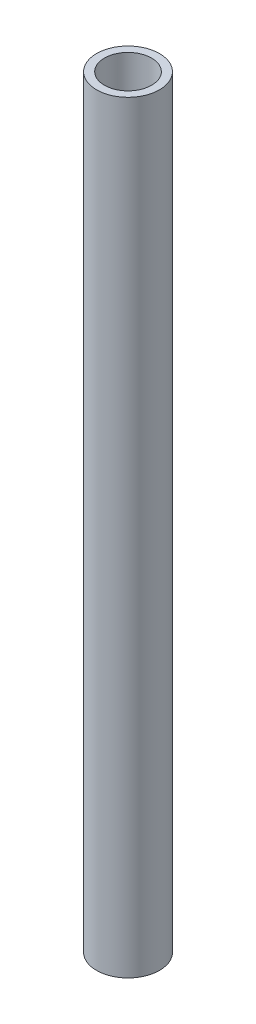
ISO-10303-21;
HEADER;
FILE_DESCRIPTION(('STEP AP214'),'2;1');
FILE_NAME('part.step','',(''),(''),'','','');
FILE_SCHEMA(('AUTOMOTIVE_DESIGN { 1 0 10303 214 1 1 1 1 }'));
ENDSEC;
DATA;
#1=APPLICATION_CONTEXT('core data for automotive mechanical design processes');
#2=APPLICATION_PROTOCOL_DEFINITION('international standard','automotive_design',2000,#1);
#3=PRODUCT_CONTEXT('',#1,'mechanical');
#4=PRODUCT('Part','Part','',(#3));
#5=PRODUCT_RELATED_PRODUCT_CATEGORY('part','',(#4));
#6=PRODUCT_DEFINITION_FORMATION('','',#4);
#7=PRODUCT_DEFINITION_CONTEXT('part definition',#1,'design');
#8=PRODUCT_DEFINITION('design','',#6,#7);
#9=PRODUCT_DEFINITION_SHAPE('','',#8);
#10=(LENGTH_UNIT() NAMED_UNIT(*) SI_UNIT(.MILLI.,.METRE.));
#11=(NAMED_UNIT(*) PLANE_ANGLE_UNIT() SI_UNIT($,.RADIAN.));
#12=(NAMED_UNIT(*) SI_UNIT($,.STERADIAN.) SOLID_ANGLE_UNIT());
#13=UNCERTAINTY_MEASURE_WITH_UNIT(LENGTH_MEASURE(1.E-05),#10,'distance_accuracy_value','');
#14=(GEOMETRIC_REPRESENTATION_CONTEXT(3) GLOBAL_UNCERTAINTY_ASSIGNED_CONTEXT((#13)) GLOBAL_UNIT_ASSIGNED_CONTEXT((#10,
#11,#12)) REPRESENTATION_CONTEXT('',''));
#15=CARTESIAN_POINT('',(0.,0.,0.));
#16=DIRECTION('',(0.,0.,1.));
#17=DIRECTION('',(1.,0.,0.));
#18=AXIS2_PLACEMENT_3D('',#15,#16,#17);
#19=CARTESIAN_POINT('',(0.,97.,0.));
#20=DIRECTION('',(0.,1.,0.));
#21=DIRECTION('',(0.,0.,1.));
#22=AXIS2_PLACEMENT_3D('',#19,#20,#21);
#23=PLANE('',#22);
#24=CARTESIAN_POINT('',(0.,97.,0.));
#25=DIRECTION('',(0.,1.,0.));
#26=DIRECTION('',(0.,0.,1.));
#27=AXIS2_PLACEMENT_3D('',#24,#25,#26);
#28=CIRCLE('',#27,4.);
#29=CARTESIAN_POINT('',(0.,97.,-4.));
#30=VERTEX_POINT('',#29);
#31=EDGE_CURVE('E10',#30,#30,#28,.T.);
#32=ORIENTED_EDGE('',*,*,#31,.T.);
#33=EDGE_LOOP('',(#32));
#34=FACE_BOUND('',#33,.T.);
#35=CARTESIAN_POINT('',(0.,97.,0.));
#36=DIRECTION('',(0.,1.,0.));
#37=DIRECTION('',(0.,0.,1.));
#38=AXIS2_PLACEMENT_3D('',#35,#36,#37);
#39=CIRCLE('',#38,3.);
#40=CARTESIAN_POINT('',(0.,97.,-3.));
#41=VERTEX_POINT('',#40);
#42=EDGE_CURVE('E48',#41,#41,#39,.T.);
#43=ORIENTED_EDGE('',*,*,#42,.F.);
#44=EDGE_LOOP('',(#43));
#45=FACE_BOUND('',#44,.T.);
#46=ADVANCED_FACE('F37',(#34,#45),#23,.T.);
#47=CARTESIAN_POINT('',(0.,0.,0.));
#48=DIRECTION('',(0.,1.,0.));
#49=DIRECTION('',(0.,0.,1.));
#50=AXIS2_PLACEMENT_3D('',#47,#48,#49);
#51=PLANE('',#50);
#52=CARTESIAN_POINT('',(0.,0.,0.));
#53=DIRECTION('',(0.,1.,0.));
#54=DIRECTION('',(0.,0.,1.));
#55=AXIS2_PLACEMENT_3D('',#52,#53,#54);
#56=CIRCLE('',#55,4.);
#57=CARTESIAN_POINT('',(0.,0.,-4.));
#58=VERTEX_POINT('',#57);
#59=EDGE_CURVE('E41',#58,#58,#56,.T.);
#60=ORIENTED_EDGE('',*,*,#59,.F.);
#61=EDGE_LOOP('',(#60));
#62=FACE_BOUND('',#61,.T.);
#63=CARTESIAN_POINT('',(0.,0.,0.));
#64=DIRECTION('',(0.,1.,0.));
#65=DIRECTION('',(0.,0.,1.));
#66=AXIS2_PLACEMENT_3D('',#63,#64,#65);
#67=CIRCLE('',#66,3.);
#68=CARTESIAN_POINT('',(0.,0.,-3.));
#69=VERTEX_POINT('',#68);
#70=EDGE_CURVE('E50',#69,#69,#67,.T.);
#71=ORIENTED_EDGE('',*,*,#70,.T.);
#72=EDGE_LOOP('',(#71));
#73=FACE_BOUND('',#72,.T.);
#74=ADVANCED_FACE('F60',(#62,#73),#51,.F.);
#75=CARTESIAN_POINT('',(0.,97.,0.));
#76=DIRECTION('',(0.,-1.,0.));
#77=DIRECTION('',(0.,0.,-1.));
#78=AXIS2_PLACEMENT_3D('',#75,#76,#77);
#79=CYLINDRICAL_SURFACE('',#78,4.);
#80=CARTESIAN_POINT('',(0.,97.,-4.));
#81=CARTESIAN_POINT('',(0.,95.9895833333333,-4.));
#82=CARTESIAN_POINT('',(0.,94.9791666666667,-4.));
#83=CARTESIAN_POINT('',(0.,92.9583333333333,-4.));
#84=CARTESIAN_POINT('',(0.,91.9479166666667,-4.));
#85=CARTESIAN_POINT('',(0.,89.9270833333333,-4.));
#86=CARTESIAN_POINT('',(0.,88.9166666666667,-4.));
#87=CARTESIAN_POINT('',(0.,86.8958333333333,-4.));
#88=CARTESIAN_POINT('',(0.,85.8854166666667,-4.));
#89=CARTESIAN_POINT('',(0.,83.8645833333333,-4.));
#90=CARTESIAN_POINT('',(0.,82.8541666666667,-4.));
#91=CARTESIAN_POINT('',(0.,80.8333333333333,-4.));
#92=CARTESIAN_POINT('',(0.,79.8229166666667,-4.));
#93=CARTESIAN_POINT('',(0.,77.8020833333333,-4.));
#94=CARTESIAN_POINT('',(0.,76.7916666666667,-4.));
#95=CARTESIAN_POINT('',(0.,74.7708333333333,-4.));
#96=CARTESIAN_POINT('',(0.,73.7604166666667,-4.));
#97=CARTESIAN_POINT('',(0.,71.7395833333333,-4.));
#98=CARTESIAN_POINT('',(0.,70.7291666666667,-4.));
#99=CARTESIAN_POINT('',(0.,68.7083333333333,-4.));
#100=CARTESIAN_POINT('',(0.,67.6979166666667,-4.));
#101=CARTESIAN_POINT('',(0.,65.6770833333333,-4.));
#102=CARTESIAN_POINT('',(0.,64.6666666666667,-4.));
#103=CARTESIAN_POINT('',(0.,62.6458333333333,-4.));
#104=CARTESIAN_POINT('',(0.,61.6354166666667,-4.));
#105=CARTESIAN_POINT('',(0.,59.6145833333333,-4.));
#106=CARTESIAN_POINT('',(0.,58.6041666666667,-4.));
#107=CARTESIAN_POINT('',(0.,56.5833333333333,-4.));
#108=CARTESIAN_POINT('',(0.,55.5729166666667,-4.));
#109=CARTESIAN_POINT('',(0.,53.5520833333333,-4.));
#110=CARTESIAN_POINT('',(0.,52.5416666666667,-4.));
#111=CARTESIAN_POINT('',(0.,50.5208333333333,-4.));
#112=CARTESIAN_POINT('',(0.,49.5104166666667,-4.));
#113=CARTESIAN_POINT('',(0.,47.4895833333333,-4.));
#114=CARTESIAN_POINT('',(0.,46.4791666666667,-4.));
#115=CARTESIAN_POINT('',(0.,44.4583333333333,-4.));
#116=CARTESIAN_POINT('',(0.,43.4479166666667,-4.));
#117=CARTESIAN_POINT('',(0.,41.4270833333333,-4.));
#118=CARTESIAN_POINT('',(0.,40.4166666666667,-4.));
#119=CARTESIAN_POINT('',(0.,38.3958333333333,-4.));
#120=CARTESIAN_POINT('',(0.,37.3854166666667,-4.));
#121=CARTESIAN_POINT('',(0.,35.3645833333333,-4.));
#122=CARTESIAN_POINT('',(0.,34.3541666666667,-4.));
#123=CARTESIAN_POINT('',(0.,32.3333333333333,-4.));
#124=CARTESIAN_POINT('',(0.,31.3229166666667,-4.));
#125=CARTESIAN_POINT('',(0.,29.3020833333333,-4.));
#126=CARTESIAN_POINT('',(0.,28.2916666666667,-4.));
#127=CARTESIAN_POINT('',(0.,26.2708333333333,-4.));
#128=CARTESIAN_POINT('',(0.,25.2604166666667,-4.));
#129=CARTESIAN_POINT('',(0.,23.2395833333333,-4.));
#130=CARTESIAN_POINT('',(0.,22.2291666666667,-4.));
#131=CARTESIAN_POINT('',(0.,20.2083333333333,-4.));
#132=CARTESIAN_POINT('',(0.,19.1979166666667,-4.));
#133=CARTESIAN_POINT('',(0.,17.1770833333333,-4.));
#134=CARTESIAN_POINT('',(0.,16.1666666666667,-4.));
#135=CARTESIAN_POINT('',(0.,14.1458333333333,-4.));
#136=CARTESIAN_POINT('',(0.,13.1354166666667,-4.));
#137=CARTESIAN_POINT('',(0.,11.1145833333333,-4.));
#138=CARTESIAN_POINT('',(0.,10.1041666666667,-4.));
#139=CARTESIAN_POINT('',(0.,8.08333333333332,-4.));
#140=CARTESIAN_POINT('',(0.,7.07291666666665,-4.));
#141=CARTESIAN_POINT('',(0.,5.05208333333332,-4.));
#142=CARTESIAN_POINT('',(0.,4.04166666666665,-4.));
#143=CARTESIAN_POINT('',(0.,2.02083333333332,-4.));
#144=CARTESIAN_POINT('',(0.,1.01041666666665,-4.));
#145=CARTESIAN_POINT('',(0.,0.,-4.));
#146=B_SPLINE_CURVE_WITH_KNOTS('',3,(#80,#81,#82,#83,#84,#85,#86,#87,#88,#89,#90,#91,#92,#93,
#94,#95,#96,#97,#98,#99,#100,#101,#102,#103,#104,#105,#106,#107,#108,#109,#110,#111,#112,#113,
#114,#115,#116,#117,#118,#119,#120,#121,#122,#123,#124,#125,#126,#127,#128,#129,#130,#131,#132,
#133,#134,#135,#136,#137,#138,#139,#140,#141,#142,#143,#144,#145),.UNSPECIFIED.,.F.,.F.,(4,2,2,
2,2,2,2,2,2,2,2,2,2,2,2,2,2,2,2,2,2,2,2,2,2,2,2,2,2,2,2,2,4),(0.,3.03125,6.0625,9.09375,12.125,
15.15625,18.1875,21.21875,24.25,27.28125,30.3125,33.34375,36.375,39.40625,42.4375,45.46875,48.5,
51.53125,54.5625,57.59375,60.625,63.65625,66.6875,69.71875,72.75,75.78125,78.8125,81.84375,
84.875,87.90625,90.9375,93.96875,97.),.UNSPECIFIED.);
#147=EDGE_CURVE('BSEAM39',#30,#58,#146,.T.);
#148=ORIENTED_EDGE('',*,*,#31,.F.);
#149=ORIENTED_EDGE('',*,*,#59,.T.);
#150=ORIENTED_EDGE('',*,*,#147,.T.);
#151=ORIENTED_EDGE('',*,*,#147,.F.);
#152=EDGE_LOOP('',(#148,#150,#149,#151));
#153=FACE_BOUND('',#152,.T.);
#154=ADVANCED_FACE('F39',(#153),#79,.T.);
#155=CARTESIAN_POINT('',(0.,97.,0.));
#156=DIRECTION('',(0.,-1.,0.));
#157=DIRECTION('',(0.,0.,-1.));
#158=AXIS2_PLACEMENT_3D('',#155,#156,#157);
#159=CYLINDRICAL_SURFACE('',#158,3.);
#160=CARTESIAN_POINT('',(0.,97.,-3.));
#161=CARTESIAN_POINT('',(0.,95.9895833333333,-3.));
#162=CARTESIAN_POINT('',(0.,94.9791666666667,-3.));
#163=CARTESIAN_POINT('',(0.,92.9583333333333,-3.));
#164=CARTESIAN_POINT('',(0.,91.9479166666667,-3.));
#165=CARTESIAN_POINT('',(0.,89.9270833333333,-3.));
#166=CARTESIAN_POINT('',(0.,88.9166666666667,-3.));
#167=CARTESIAN_POINT('',(0.,86.8958333333333,-3.));
#168=CARTESIAN_POINT('',(0.,85.8854166666667,-3.));
#169=CARTESIAN_POINT('',(0.,83.8645833333333,-3.));
#170=CARTESIAN_POINT('',(0.,82.8541666666667,-3.));
#171=CARTESIAN_POINT('',(0.,80.8333333333333,-3.));
#172=CARTESIAN_POINT('',(0.,79.8229166666667,-3.));
#173=CARTESIAN_POINT('',(0.,77.8020833333333,-3.));
#174=CARTESIAN_POINT('',(0.,76.7916666666667,-3.));
#175=CARTESIAN_POINT('',(0.,74.7708333333333,-3.));
#176=CARTESIAN_POINT('',(0.,73.7604166666667,-3.));
#177=CARTESIAN_POINT('',(0.,71.7395833333333,-3.));
#178=CARTESIAN_POINT('',(0.,70.7291666666667,-3.));
#179=CARTESIAN_POINT('',(0.,68.7083333333333,-3.));
#180=CARTESIAN_POINT('',(0.,67.6979166666666,-3.));
#181=CARTESIAN_POINT('',(0.,65.6770833333333,-3.));
#182=CARTESIAN_POINT('',(0.,64.6666666666667,-3.));
#183=CARTESIAN_POINT('',(0.,62.6458333333333,-3.));
#184=CARTESIAN_POINT('',(0.,61.6354166666667,-3.));
#185=CARTESIAN_POINT('',(0.,59.6145833333333,-3.));
#186=CARTESIAN_POINT('',(0.,58.6041666666667,-3.));
#187=CARTESIAN_POINT('',(0.,56.5833333333333,-3.));
#188=CARTESIAN_POINT('',(0.,55.5729166666667,-3.));
#189=CARTESIAN_POINT('',(0.,53.5520833333333,-3.));
#190=CARTESIAN_POINT('',(0.,52.5416666666667,-3.));
#191=CARTESIAN_POINT('',(0.,50.5208333333333,-3.));
#192=CARTESIAN_POINT('',(0.,49.5104166666667,-3.));
#193=CARTESIAN_POINT('',(0.,47.4895833333333,-3.));
#194=CARTESIAN_POINT('',(0.,46.4791666666667,-3.));
#195=CARTESIAN_POINT('',(0.,44.4583333333333,-3.));
#196=CARTESIAN_POINT('',(0.,43.4479166666667,-3.));
#197=CARTESIAN_POINT('',(0.,41.4270833333333,-3.));
#198=CARTESIAN_POINT('',(0.,40.4166666666667,-3.));
#199=CARTESIAN_POINT('',(0.,38.3958333333333,-3.));
#200=CARTESIAN_POINT('',(0.,37.3854166666667,-3.));
#201=CARTESIAN_POINT('',(0.,35.3645833333333,-3.));
#202=CARTESIAN_POINT('',(0.,34.3541666666667,-3.));
#203=CARTESIAN_POINT('',(0.,32.3333333333333,-3.));
#204=CARTESIAN_POINT('',(0.,31.3229166666667,-3.));
#205=CARTESIAN_POINT('',(0.,29.3020833333333,-3.));
#206=CARTESIAN_POINT('',(0.,28.2916666666667,-3.));
#207=CARTESIAN_POINT('',(0.,26.2708333333333,-3.));
#208=CARTESIAN_POINT('',(0.,25.2604166666667,-3.));
#209=CARTESIAN_POINT('',(0.,23.2395833333333,-3.));
#210=CARTESIAN_POINT('',(0.,22.2291666666667,-3.));
#211=CARTESIAN_POINT('',(0.,20.2083333333333,-3.));
#212=CARTESIAN_POINT('',(0.,19.1979166666667,-3.));
#213=CARTESIAN_POINT('',(0.,17.1770833333333,-3.));
#214=CARTESIAN_POINT('',(0.,16.1666666666667,-3.));
#215=CARTESIAN_POINT('',(0.,14.1458333333333,-3.));
#216=CARTESIAN_POINT('',(0.,13.1354166666667,-3.));
#217=CARTESIAN_POINT('',(0.,11.1145833333333,-3.));
#218=CARTESIAN_POINT('',(0.,10.1041666666667,-3.));
#219=CARTESIAN_POINT('',(0.,8.08333333333332,-3.));
#220=CARTESIAN_POINT('',(0.,7.07291666666665,-3.));
#221=CARTESIAN_POINT('',(0.,5.05208333333332,-3.));
#222=CARTESIAN_POINT('',(0.,4.04166666666665,-3.));
#223=CARTESIAN_POINT('',(0.,2.02083333333332,-3.));
#224=CARTESIAN_POINT('',(0.,1.01041666666665,-3.));
#225=CARTESIAN_POINT('',(0.,0.,-3.));
#226=B_SPLINE_CURVE_WITH_KNOTS('',3,(#160,#161,#162,#163,#164,#165,#166,#167,#168,#169,#170,
#171,#172,#173,#174,#175,#176,#177,#178,#179,#180,#181,#182,#183,#184,#185,#186,#187,#188,#189,
#190,#191,#192,#193,#194,#195,#196,#197,#198,#199,#200,#201,#202,#203,#204,#205,#206,#207,#208,
#209,#210,#211,#212,#213,#214,#215,#216,#217,#218,#219,#220,#221,#222,#223,#224,#225),
.UNSPECIFIED.,.F.,.F.,(4,2,2,2,2,2,2,2,2,2,2,2,2,2,2,2,2,2,2,2,2,2,2,2,2,2,2,2,2,2,2,2,4),(0.,
3.03125000000001,6.06250000000001,9.09375000000001,12.125,15.15625,18.1875,21.21875,24.25,
27.28125,30.3125,33.34375,36.375,39.40625,42.4375,45.46875,48.5,51.53125,54.5625,57.59375,
60.625,63.65625,66.6875,69.71875,72.75,75.78125,78.8125,81.84375,84.875,87.90625,90.9375,
93.96875,97.),.UNSPECIFIED.);
#227=EDGE_CURVE('BSEAM56',#41,#69,#226,.T.);
#228=ORIENTED_EDGE('',*,*,#42,.T.);
#229=ORIENTED_EDGE('',*,*,#70,.F.);
#230=ORIENTED_EDGE('',*,*,#227,.T.);
#231=ORIENTED_EDGE('',*,*,#227,.F.);
#232=EDGE_LOOP('',(#228,#230,#229,#231));
#233=FACE_BOUND('',#232,.T.);
#234=ADVANCED_FACE('F56',(#233),#159,.F.);
#235=CLOSED_SHELL('',(#46,#74,#154,#234));
#236=MANIFOLD_SOLID_BREP('B2',#235);
#237=ADVANCED_BREP_SHAPE_REPRESENTATION('',(#18,#236),#14);
#238=SHAPE_DEFINITION_REPRESENTATION(#9,#237);
ENDSEC;
END-ISO-10303-21;
